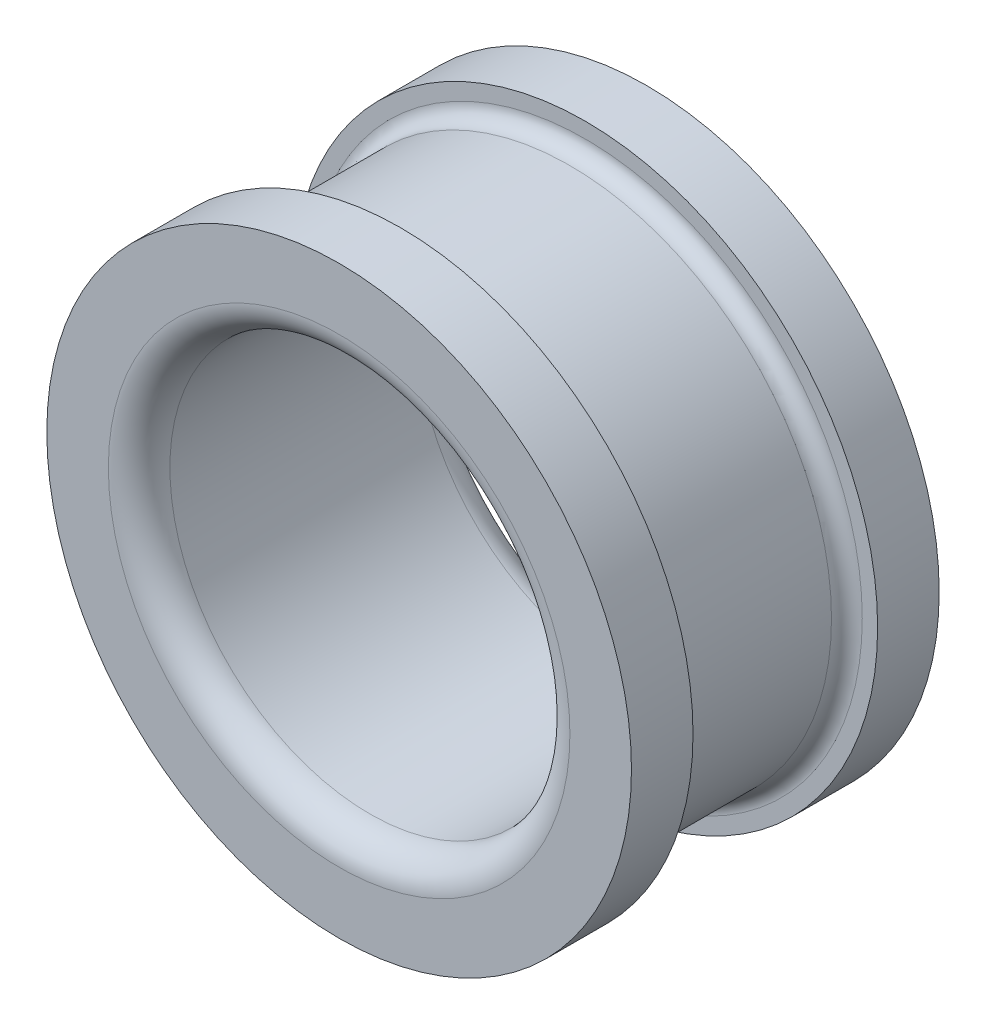
ISO-10303-21;
HEADER;
FILE_DESCRIPTION(('STEP AP214'),'2;1');
FILE_NAME('part.step','',(''),(''),'','','');
FILE_SCHEMA(('AUTOMOTIVE_DESIGN { 1 0 10303 214 1 1 1 1 }'));
ENDSEC;
DATA;
#1=APPLICATION_CONTEXT('core data for automotive mechanical design processes');
#2=APPLICATION_PROTOCOL_DEFINITION('international standard','automotive_design',2000,#1);
#3=PRODUCT_CONTEXT('',#1,'mechanical');
#4=PRODUCT('Part','Part','',(#3));
#5=PRODUCT_RELATED_PRODUCT_CATEGORY('part','',(#4));
#6=PRODUCT_DEFINITION_FORMATION('','',#4);
#7=PRODUCT_DEFINITION_CONTEXT('part definition',#1,'design');
#8=PRODUCT_DEFINITION('design','',#6,#7);
#9=PRODUCT_DEFINITION_SHAPE('','',#8);
#10=(LENGTH_UNIT() NAMED_UNIT(*) SI_UNIT(.MILLI.,.METRE.));
#11=(NAMED_UNIT(*) PLANE_ANGLE_UNIT() SI_UNIT($,.RADIAN.));
#12=(NAMED_UNIT(*) SI_UNIT($,.STERADIAN.) SOLID_ANGLE_UNIT());
#13=UNCERTAINTY_MEASURE_WITH_UNIT(LENGTH_MEASURE(1.E-05),#10,'distance_accuracy_value','');
#14=(GEOMETRIC_REPRESENTATION_CONTEXT(3) GLOBAL_UNCERTAINTY_ASSIGNED_CONTEXT((#13)) GLOBAL_UNIT_ASSIGNED_CONTEXT((#10,
#11,#12)) REPRESENTATION_CONTEXT('',''));
#15=CARTESIAN_POINT('',(0.,0.,0.));
#16=DIRECTION('',(0.,0.,1.));
#17=DIRECTION('',(1.,0.,0.));
#18=AXIS2_PLACEMENT_3D('',#15,#16,#17);
#19=CARTESIAN_POINT('',(0.,0.,2.));
#20=DIRECTION('',(0.,0.,-1.));
#21=DIRECTION('',(-1.,0.,0.));
#22=AXIS2_PLACEMENT_3D('',#19,#20,#21);
#23=CYLINDRICAL_SURFACE('',#22,9.5);
#24=CARTESIAN_POINT('',(0.,0.,2.));
#25=DIRECTION('',(0.,0.,1.));
#26=DIRECTION('',(1.,0.,0.));
#27=AXIS2_PLACEMENT_3D('',#24,#25,#26);
#28=CIRCLE('',#27,9.5);
#29=CARTESIAN_POINT('',(9.5,0.,2.));
#30=VERTEX_POINT('',#29);
#31=EDGE_CURVE('E77',#30,#30,#28,.T.);
#32=ORIENTED_EDGE('',*,*,#31,.F.);
#33=EDGE_LOOP('',(#32));
#34=FACE_BOUND('',#33,.T.);
#35=CARTESIAN_POINT('',(0.,0.,0.));
#36=DIRECTION('',(0.,0.,1.));
#37=DIRECTION('',(1.,0.,0.));
#38=AXIS2_PLACEMENT_3D('',#35,#36,#37);
#39=CIRCLE('',#38,9.5);
#40=CARTESIAN_POINT('',(9.5,0.,0.));
#41=VERTEX_POINT('',#40);
#42=EDGE_CURVE('E78',#41,#41,#39,.T.);
#43=ORIENTED_EDGE('',*,*,#42,.T.);
#44=EDGE_LOOP('',(#43));
#45=FACE_BOUND('',#44,.T.);
#46=ADVANCED_FACE('F37',(#34,#45),#23,.T.);
#47=CARTESIAN_POINT('',(0.,0.,2.));
#48=DIRECTION('',(0.,0.,1.));
#49=DIRECTION('',(1.,0.,0.));
#50=AXIS2_PLACEMENT_3D('',#47,#48,#49);
#51=PLANE('',#50);
#52=CARTESIAN_POINT('',(0.,0.,2.));
#53=DIRECTION('',(0.,0.,1.));
#54=DIRECTION('',(1.,0.,0.));
#55=AXIS2_PLACEMENT_3D('',#52,#53,#54);
#56=CIRCLE('',#55,9.);
#57=CARTESIAN_POINT('',(9.,0.,2.));
#58=VERTEX_POINT('',#57);
#59=EDGE_CURVE('E10',#58,#58,#56,.F.);
#60=ORIENTED_EDGE('',*,*,#59,.T.);
#61=EDGE_LOOP('',(#60));
#62=FACE_BOUND('',#61,.T.);
#63=ORIENTED_EDGE('',*,*,#31,.T.);
#64=EDGE_LOOP('',(#63));
#65=FACE_BOUND('',#64,.T.);
#66=ADVANCED_FACE('F118',(#62,#65),#51,.T.);
#67=CARTESIAN_POINT('',(0.,0.,0.));
#68=DIRECTION('',(0.,0.,1.));
#69=DIRECTION('',(1.,0.,0.));
#70=AXIS2_PLACEMENT_3D('',#67,#68,#69);
#71=PLANE('',#70);
#72=CARTESIAN_POINT('',(0.,0.,0.));
#73=DIRECTION('',(0.,0.,1.));
#74=DIRECTION('',(1.,0.,0.));
#75=AXIS2_PLACEMENT_3D('',#72,#73,#74);
#76=CIRCLE('',#75,7.5);
#77=CARTESIAN_POINT('',(7.5,0.,0.));
#78=VERTEX_POINT('',#77);
#79=EDGE_CURVE('E73',#78,#78,#76,.T.);
#80=ORIENTED_EDGE('',*,*,#79,.T.);
#81=EDGE_LOOP('',(#80));
#82=FACE_BOUND('',#81,.T.);
#83=ORIENTED_EDGE('',*,*,#42,.F.);
#84=EDGE_LOOP('',(#83));
#85=FACE_BOUND('',#84,.T.);
#86=ADVANCED_FACE('F124',(#82,#85),#71,.F.);
#87=CARTESIAN_POINT('',(0.,0.,8.));
#88=DIRECTION('',(0.,0.,-1.));
#89=DIRECTION('',(-1.,0.,0.));
#90=AXIS2_PLACEMENT_3D('',#87,#88,#89);
#91=CYLINDRICAL_SURFACE('',#90,8.5);
#92=CARTESIAN_POINT('',(0.,0.,7.5));
#93=DIRECTION('',(0.,0.,1.));
#94=DIRECTION('',(1.,0.,0.));
#95=AXIS2_PLACEMENT_3D('',#92,#93,#94);
#96=CIRCLE('',#95,8.5);
#97=CARTESIAN_POINT('',(8.5,0.,7.5));
#98=VERTEX_POINT('',#97);
#99=EDGE_CURVE('E45',#98,#98,#96,.F.);
#100=ORIENTED_EDGE('',*,*,#99,.T.);
#101=EDGE_LOOP('',(#100));
#102=FACE_BOUND('',#101,.T.);
#103=CARTESIAN_POINT('',(0.,0.,2.5));
#104=DIRECTION('',(0.,0.,1.));
#105=DIRECTION('',(1.,0.,0.));
#106=AXIS2_PLACEMENT_3D('',#103,#104,#105);
#107=CIRCLE('',#106,8.5);
#108=CARTESIAN_POINT('',(8.5,0.,2.5));
#109=VERTEX_POINT('',#108);
#110=EDGE_CURVE('E50',#109,#109,#107,.T.);
#111=ORIENTED_EDGE('',*,*,#110,.T.);
#112=EDGE_LOOP('',(#111));
#113=FACE_BOUND('',#112,.T.);
#114=ADVANCED_FACE('F99',(#102,#113),#91,.T.);
#115=CARTESIAN_POINT('',(0.,0.,10.));
#116=DIRECTION('',(0.,0.,-1.));
#117=DIRECTION('',(-1.,0.,0.));
#118=AXIS2_PLACEMENT_3D('',#115,#116,#117);
#119=CYLINDRICAL_SURFACE('',#118,9.5);
#120=CARTESIAN_POINT('',(0.,0.,10.));
#121=DIRECTION('',(0.,0.,1.));
#122=DIRECTION('',(1.,0.,0.));
#123=AXIS2_PLACEMENT_3D('',#120,#121,#122);
#124=CIRCLE('',#123,9.5);
#125=CARTESIAN_POINT('',(9.5,0.,10.));
#126=VERTEX_POINT('',#125);
#127=EDGE_CURVE('E82',#126,#126,#124,.T.);
#128=ORIENTED_EDGE('',*,*,#127,.F.);
#129=EDGE_LOOP('',(#128));
#130=FACE_BOUND('',#129,.T.);
#131=CARTESIAN_POINT('',(0.,0.,8.));
#132=DIRECTION('',(0.,0.,1.));
#133=DIRECTION('',(1.,0.,0.));
#134=AXIS2_PLACEMENT_3D('',#131,#132,#133);
#135=CIRCLE('',#134,9.5);
#136=CARTESIAN_POINT('',(9.5,0.,8.));
#137=VERTEX_POINT('',#136);
#138=EDGE_CURVE('E86',#137,#137,#135,.T.);
#139=ORIENTED_EDGE('',*,*,#138,.T.);
#140=EDGE_LOOP('',(#139));
#141=FACE_BOUND('',#140,.T.);
#142=ADVANCED_FACE('F96',(#130,#141),#119,.T.);
#143=CARTESIAN_POINT('',(0.,0.,10.));
#144=DIRECTION('',(0.,0.,1.));
#145=DIRECTION('',(1.,0.,0.));
#146=AXIS2_PLACEMENT_3D('',#143,#144,#145);
#147=PLANE('',#146);
#148=CARTESIAN_POINT('',(0.,0.,10.));
#149=DIRECTION('',(0.,0.,1.));
#150=DIRECTION('',(1.,0.,0.));
#151=AXIS2_PLACEMENT_3D('',#148,#149,#150);
#152=CIRCLE('',#151,7.5);
#153=CARTESIAN_POINT('',(7.5,0.,10.));
#154=VERTEX_POINT('',#153);
#155=EDGE_CURVE('E61',#154,#154,#152,.F.);
#156=ORIENTED_EDGE('',*,*,#155,.T.);
#157=EDGE_LOOP('',(#156));
#158=FACE_BOUND('',#157,.T.);
#159=ORIENTED_EDGE('',*,*,#127,.T.);
#160=EDGE_LOOP('',(#159));
#161=FACE_BOUND('',#160,.T.);
#162=ADVANCED_FACE('F94',(#158,#161),#147,.T.);
#163=CARTESIAN_POINT('',(0.,0.,8.));
#164=DIRECTION('',(0.,0.,1.));
#165=DIRECTION('',(1.,0.,0.));
#166=AXIS2_PLACEMENT_3D('',#163,#164,#165);
#167=PLANE('',#166);
#168=CARTESIAN_POINT('',(0.,0.,8.));
#169=DIRECTION('',(0.,0.,1.));
#170=DIRECTION('',(1.,0.,0.));
#171=AXIS2_PLACEMENT_3D('',#168,#169,#170);
#172=CIRCLE('',#171,9.);
#173=CARTESIAN_POINT('',(9.,0.,8.));
#174=VERTEX_POINT('',#173);
#175=EDGE_CURVE('E55',#174,#174,#172,.T.);
#176=ORIENTED_EDGE('',*,*,#175,.T.);
#177=EDGE_LOOP('',(#176));
#178=FACE_BOUND('',#177,.T.);
#179=ORIENTED_EDGE('',*,*,#138,.F.);
#180=EDGE_LOOP('',(#179));
#181=FACE_BOUND('',#180,.T.);
#182=ADVANCED_FACE('F103',(#178,#181),#167,.F.);
#183=CARTESIAN_POINT('',(0.,0.,10.));
#184=DIRECTION('',(0.,0.,-1.));
#185=DIRECTION('',(-1.,0.,0.));
#186=AXIS2_PLACEMENT_3D('',#183,#184,#185);
#187=CYLINDRICAL_SURFACE('',#186,6.5);
#188=CARTESIAN_POINT('',(0.,0.,0.999999999999999));
#189=DIRECTION('',(0.,0.,1.));
#190=DIRECTION('',(1.,0.,0.));
#191=AXIS2_PLACEMENT_3D('',#188,#189,#190);
#192=CIRCLE('',#191,6.5);
#193=CARTESIAN_POINT('',(6.5,0.,0.999999999999999));
#194=VERTEX_POINT('',#193);
#195=EDGE_CURVE('E65',#194,#194,#192,.F.);
#196=ORIENTED_EDGE('',*,*,#195,.T.);
#197=EDGE_LOOP('',(#196));
#198=FACE_BOUND('',#197,.T.);
#199=CARTESIAN_POINT('',(0.,0.,9.));
#200=DIRECTION('',(0.,0.,1.));
#201=DIRECTION('',(1.,0.,0.));
#202=AXIS2_PLACEMENT_3D('',#199,#200,#201);
#203=CIRCLE('',#202,6.5);
#204=CARTESIAN_POINT('',(6.5,0.,9.));
#205=VERTEX_POINT('',#204);
#206=EDGE_CURVE('E69',#205,#205,#203,.T.);
#207=ORIENTED_EDGE('',*,*,#206,.T.);
#208=EDGE_LOOP('',(#207));
#209=FACE_BOUND('',#208,.T.);
#210=ADVANCED_FACE('F105',(#198,#209),#187,.F.);
#211=CARTESIAN_POINT('',(0.,0.,0.999999999999999));
#212=DIRECTION('',(0.,0.,1.));
#213=DIRECTION('',(1.,0.,0.));
#214=AXIS2_PLACEMENT_3D('',#211,#212,#213);
#215=TOROIDAL_SURFACE('',#214,7.5,1.);
#216=ORIENTED_EDGE('',*,*,#195,.F.);
#217=EDGE_LOOP('',(#216));
#218=FACE_BOUND('',#217,.T.);
#219=ORIENTED_EDGE('',*,*,#79,.F.);
#220=EDGE_LOOP('',(#219));
#221=FACE_BOUND('',#220,.T.);
#222=ADVANCED_FACE('F112',(#218,#221),#215,.T.);
#223=CARTESIAN_POINT('',(0.,0.,9.));
#224=DIRECTION('',(0.,0.,1.));
#225=DIRECTION('',(1.,0.,0.));
#226=AXIS2_PLACEMENT_3D('',#223,#224,#225);
#227=TOROIDAL_SURFACE('',#226,7.5,1.);
#228=ORIENTED_EDGE('',*,*,#206,.F.);
#229=EDGE_LOOP('',(#228));
#230=FACE_BOUND('',#229,.T.);
#231=ORIENTED_EDGE('',*,*,#155,.F.);
#232=EDGE_LOOP('',(#231));
#233=FACE_BOUND('',#232,.T.);
#234=ADVANCED_FACE('F132',(#230,#233),#227,.T.);
#235=CARTESIAN_POINT('',(0.,0.,7.5));
#236=DIRECTION('',(0.,0.,1.));
#237=DIRECTION('',(1.,0.,0.));
#238=AXIS2_PLACEMENT_3D('',#235,#236,#237);
#239=TOROIDAL_SURFACE('',#238,9.,0.5);
#240=ORIENTED_EDGE('',*,*,#99,.F.);
#241=EDGE_LOOP('',(#240));
#242=FACE_BOUND('',#241,.T.);
#243=ORIENTED_EDGE('',*,*,#175,.F.);
#244=EDGE_LOOP('',(#243));
#245=FACE_BOUND('',#244,.T.);
#246=ADVANCED_FACE('F135',(#242,#245),#239,.F.);
#247=CARTESIAN_POINT('',(0.,0.,2.5));
#248=DIRECTION('',(0.,0.,1.));
#249=DIRECTION('',(1.,0.,0.));
#250=AXIS2_PLACEMENT_3D('',#247,#248,#249);
#251=TOROIDAL_SURFACE('',#250,9.,0.5);
#252=ORIENTED_EDGE('',*,*,#59,.F.);
#253=EDGE_LOOP('',(#252));
#254=FACE_BOUND('',#253,.T.);
#255=ORIENTED_EDGE('',*,*,#110,.F.);
#256=EDGE_LOOP('',(#255));
#257=FACE_BOUND('',#256,.T.);
#258=ADVANCED_FACE('F39',(#254,#257),#251,.F.);
#259=CLOSED_SHELL('',(#46,#66,#86,#114,#142,#162,#182,#210,#222,#234,#246,#258));
#260=MANIFOLD_SOLID_BREP('B2',#259);
#261=ADVANCED_BREP_SHAPE_REPRESENTATION('',(#18,#260),#14);
#262=SHAPE_DEFINITION_REPRESENTATION(#9,#261);
ENDSEC;
END-ISO-10303-21;
